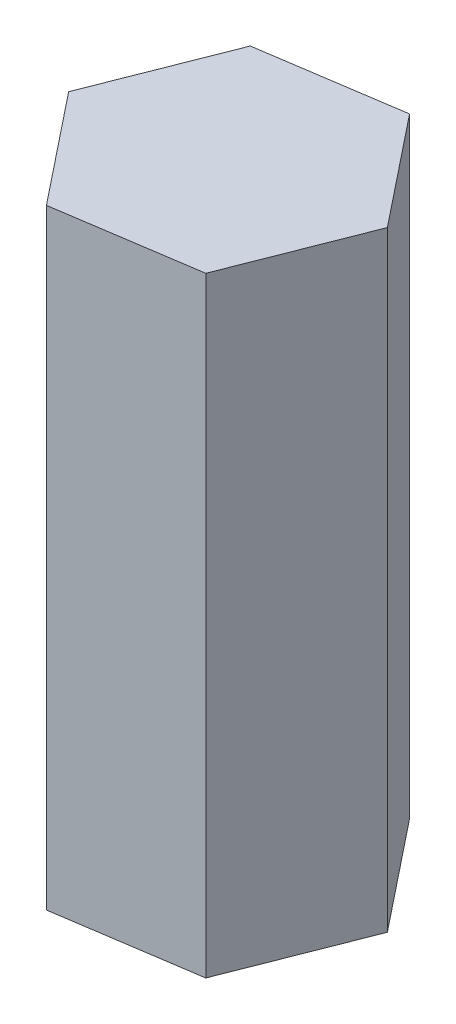
ISO-10303-21;
HEADER;
FILE_DESCRIPTION(('STEP AP214'),'2;1');
FILE_NAME('part.step','',(''),(''),'','','');
FILE_SCHEMA(('AUTOMOTIVE_DESIGN { 1 0 10303 214 1 1 1 1 }'));
ENDSEC;
DATA;
#1=APPLICATION_CONTEXT('core data for automotive mechanical design processes');
#2=APPLICATION_PROTOCOL_DEFINITION('international standard','automotive_design',2000,#1);
#3=PRODUCT_CONTEXT('',#1,'mechanical');
#4=PRODUCT('Part','Part','',(#3));
#5=PRODUCT_RELATED_PRODUCT_CATEGORY('part','',(#4));
#6=PRODUCT_DEFINITION_FORMATION('','',#4);
#7=PRODUCT_DEFINITION_CONTEXT('part definition',#1,'design');
#8=PRODUCT_DEFINITION('design','',#6,#7);
#9=PRODUCT_DEFINITION_SHAPE('','',#8);
#10=(LENGTH_UNIT() NAMED_UNIT(*) SI_UNIT(.MILLI.,.METRE.));
#11=(NAMED_UNIT(*) PLANE_ANGLE_UNIT() SI_UNIT($,.RADIAN.));
#12=(NAMED_UNIT(*) SI_UNIT($,.STERADIAN.) SOLID_ANGLE_UNIT());
#13=UNCERTAINTY_MEASURE_WITH_UNIT(LENGTH_MEASURE(1.E-05),#10,'distance_accuracy_value','');
#14=(GEOMETRIC_REPRESENTATION_CONTEXT(3) GLOBAL_UNCERTAINTY_ASSIGNED_CONTEXT((#13)) GLOBAL_UNIT_ASSIGNED_CONTEXT((#10,
#11,#12)) REPRESENTATION_CONTEXT('',''));
#15=CARTESIAN_POINT('',(0.,0.,0.));
#16=DIRECTION('',(0.,0.,1.));
#17=DIRECTION('',(1.,0.,0.));
#18=AXIS2_PLACEMENT_3D('',#15,#16,#17);
#19=CARTESIAN_POINT('',(3.3550190188715,40.,-8.5448140636886));
#20=DIRECTION('',(0.148899215186265,0.,0.988852377110413));
#21=DIRECTION('',(0.988852377110413,0.,-0.148899215186265));
#22=AXIS2_PLACEMENT_3D('',#19,#20,#21);
#23=PLANE('',#22);
#24=DIRECTION('',(-0.988852377110413,0.,0.148899215186265));
#25=VECTOR('',#24,1.);
#26=CARTESIAN_POINT('',(3.3550190188715,0.,-8.5448140636886));
#27=LINE('',#26,#25);
#28=CARTESIAN_POINT('',(3.3550190188715,0.,-8.5448140636886));
#29=VERTEX_POINT('',#28);
#30=CARTESIAN_POINT('',(-5.72251654033312,0.,-7.17793873236697));
#31=VERTEX_POINT('',#30);
#32=EDGE_CURVE('E132',#29,#31,#27,.T.);
#33=ORIENTED_EDGE('',*,*,#32,.T.);
#34=DIRECTION('',(0.,-1.,0.));
#35=VECTOR('',#34,1.);
#36=CARTESIAN_POINT('',(-5.72251654033312,40.,-7.17793873236697));
#37=LINE('',#36,#35);
#38=CARTESIAN_POINT('',(-5.72251654033312,40.,-7.17793873236697));
#39=VERTEX_POINT('',#38);
#40=EDGE_CURVE('E11',#39,#31,#37,.T.);
#41=ORIENTED_EDGE('',*,*,#40,.F.);
#42=DIRECTION('',(-0.988852377110413,0.,0.148899215186265));
#43=VECTOR('',#42,1.);
#44=CARTESIAN_POINT('',(3.3550190188715,40.,-8.5448140636886));
#45=LINE('',#44,#43);
#46=CARTESIAN_POINT('',(3.3550190188715,40.,-8.5448140636886));
#47=VERTEX_POINT('',#46);
#48=EDGE_CURVE('E148',#47,#39,#45,.T.);
#49=ORIENTED_EDGE('',*,*,#48,.F.);
#50=DIRECTION('',(0.,-1.,0.));
#51=VECTOR('',#50,1.);
#52=CARTESIAN_POINT('',(3.3550190188715,40.,-8.5448140636886));
#53=LINE('',#52,#51);
#54=EDGE_CURVE('E128',#47,#29,#53,.T.);
#55=ORIENTED_EDGE('',*,*,#54,.T.);
#56=EDGE_LOOP('',(#33,#41,#49,#55));
#57=FACE_BOUND('',#56,.T.);
#58=ADVANCED_FACE('F43',(#57),#23,.F.);
#59=CARTESIAN_POINT('',(-5.72251654033312,40.,-7.17793873236697));
#60=DIRECTION('',(0.93082088676338,0.,0.365475685600335));
#61=DIRECTION('',(0.365475685600335,0.,-0.93082088676338));
#62=AXIS2_PLACEMENT_3D('',#59,#60,#61);
#63=PLANE('',#62);
#64=DIRECTION('',(-0.365475685600335,0.,0.93082088676338));
#65=VECTOR('',#64,1.);
#66=CARTESIAN_POINT('',(-5.72251654033312,0.,-7.17793873236697));
#67=LINE('',#66,#65);
#68=CARTESIAN_POINT('',(-9.07753555920462,0.,1.36687533132164));
#69=VERTEX_POINT('',#68);
#70=EDGE_CURVE('E136',#31,#69,#67,.T.);
#71=ORIENTED_EDGE('',*,*,#70,.T.);
#72=DIRECTION('',(0.,-1.,0.));
#73=VECTOR('',#72,1.);
#74=CARTESIAN_POINT('',(-9.07753555920462,40.,1.36687533132164));
#75=LINE('',#74,#73);
#76=CARTESIAN_POINT('',(-9.07753555920462,40.,1.36687533132164));
#77=VERTEX_POINT('',#76);
#78=EDGE_CURVE('E52',#77,#69,#75,.T.);
#79=ORIENTED_EDGE('',*,*,#78,.F.);
#80=DIRECTION('',(-0.365475685600335,0.,0.93082088676338));
#81=VECTOR('',#80,1.);
#82=CARTESIAN_POINT('',(-5.72251654033312,40.,-7.17793873236697));
#83=LINE('',#82,#81);
#84=EDGE_CURVE('E97',#39,#77,#83,.T.);
#85=ORIENTED_EDGE('',*,*,#84,.F.);
#86=ORIENTED_EDGE('',*,*,#40,.T.);
#87=EDGE_LOOP('',(#71,#79,#85,#86));
#88=FACE_BOUND('',#87,.T.);
#89=ADVANCED_FACE('F176',(#88),#63,.F.);
#90=CARTESIAN_POINT('',(-9.07753555920462,40.,1.36687533132164));
#91=DIRECTION('',(0.781921671577115,0.,-0.623376691510078));
#92=DIRECTION('',(-0.623376691510078,0.,-0.781921671577115));
#93=AXIS2_PLACEMENT_3D('',#90,#91,#92);
#94=PLANE('',#93);
#95=DIRECTION('',(0.623376691510078,0.,0.781921671577115));
#96=VECTOR('',#95,1.);
#97=CARTESIAN_POINT('',(-9.07753555920462,0.,1.36687533132164));
#98=LINE('',#97,#96);
#99=CARTESIAN_POINT('',(-3.3550190188715,0.,8.5448140636886));
#100=VERTEX_POINT('',#99);
#101=EDGE_CURVE('E139',#69,#100,#98,.T.);
#102=ORIENTED_EDGE('',*,*,#101,.T.);
#103=DIRECTION('',(0.,-1.,0.));
#104=VECTOR('',#103,1.);
#105=CARTESIAN_POINT('',(-3.3550190188715,40.,8.5448140636886));
#106=LINE('',#105,#104);
#107=CARTESIAN_POINT('',(-3.3550190188715,40.,8.5448140636886));
#108=VERTEX_POINT('',#107);
#109=EDGE_CURVE('E121',#108,#100,#106,.T.);
#110=ORIENTED_EDGE('',*,*,#109,.F.);
#111=DIRECTION('',(0.623376691510078,0.,0.781921671577115));
#112=VECTOR('',#111,1.);
#113=CARTESIAN_POINT('',(-9.07753555920462,40.,1.36687533132164));
#114=LINE('',#113,#112);
#115=EDGE_CURVE('E110',#77,#108,#114,.T.);
#116=ORIENTED_EDGE('',*,*,#115,.F.);
#117=ORIENTED_EDGE('',*,*,#78,.T.);
#118=EDGE_LOOP('',(#102,#110,#116,#117));
#119=FACE_BOUND('',#118,.T.);
#120=ADVANCED_FACE('F158',(#119),#94,.F.);
#121=CARTESIAN_POINT('',(-3.3550190188715,40.,8.5448140636886));
#122=DIRECTION('',(-0.148899215186265,0.,-0.988852377110413));
#123=DIRECTION('',(-0.988852377110413,0.,0.148899215186265));
#124=AXIS2_PLACEMENT_3D('',#121,#122,#123);
#125=PLANE('',#124);
#126=DIRECTION('',(0.988852377110413,0.,-0.148899215186265));
#127=VECTOR('',#126,1.);
#128=CARTESIAN_POINT('',(-3.3550190188715,0.,8.5448140636886));
#129=LINE('',#128,#127);
#130=CARTESIAN_POINT('',(5.72251654033312,0.,7.17793873236697));
#131=VERTEX_POINT('',#130);
#132=EDGE_CURVE('E119',#100,#131,#129,.T.);
#133=ORIENTED_EDGE('',*,*,#132,.T.);
#134=DIRECTION('',(0.,-1.,0.));
#135=VECTOR('',#134,1.);
#136=CARTESIAN_POINT('',(5.72251654033312,40.,7.17793873236697));
#137=LINE('',#136,#135);
#138=CARTESIAN_POINT('',(5.72251654033312,40.,7.17793873236697));
#139=VERTEX_POINT('',#138);
#140=EDGE_CURVE('E116',#139,#131,#137,.T.);
#141=ORIENTED_EDGE('',*,*,#140,.F.);
#142=DIRECTION('',(0.988852377110413,0.,-0.148899215186265));
#143=VECTOR('',#142,1.);
#144=CARTESIAN_POINT('',(-3.3550190188715,40.,8.5448140636886));
#145=LINE('',#144,#143);
#146=EDGE_CURVE('E104',#108,#139,#145,.T.);
#147=ORIENTED_EDGE('',*,*,#146,.F.);
#148=ORIENTED_EDGE('',*,*,#109,.T.);
#149=EDGE_LOOP('',(#133,#141,#147,#148));
#150=FACE_BOUND('',#149,.T.);
#151=ADVANCED_FACE('F117',(#150),#125,.F.);
#152=CARTESIAN_POINT('',(5.72251654033312,40.,7.17793873236697));
#153=DIRECTION('',(-0.93082088676338,0.,-0.365475685600335));
#154=DIRECTION('',(-0.365475685600335,0.,0.93082088676338));
#155=AXIS2_PLACEMENT_3D('',#152,#153,#154);
#156=PLANE('',#155);
#157=DIRECTION('',(0.365475685600335,0.,-0.93082088676338));
#158=VECTOR('',#157,1.);
#159=CARTESIAN_POINT('',(5.72251654033312,0.,7.17793873236697));
#160=LINE('',#159,#158);
#161=CARTESIAN_POINT('',(9.07753555920462,0.,-1.36687533132164));
#162=VERTEX_POINT('',#161);
#163=EDGE_CURVE('E83',#131,#162,#160,.T.);
#164=ORIENTED_EDGE('',*,*,#163,.T.);
#165=DIRECTION('',(0.,-1.,0.));
#166=VECTOR('',#165,1.);
#167=CARTESIAN_POINT('',(9.07753555920462,40.,-1.36687533132164));
#168=LINE('',#167,#166);
#169=CARTESIAN_POINT('',(9.07753555920462,40.,-1.36687533132164));
#170=VERTEX_POINT('',#169);
#171=EDGE_CURVE('E122',#170,#162,#168,.T.);
#172=ORIENTED_EDGE('',*,*,#171,.F.);
#173=DIRECTION('',(0.365475685600335,0.,-0.93082088676338));
#174=VECTOR('',#173,1.);
#175=CARTESIAN_POINT('',(5.72251654033312,40.,7.17793873236697));
#176=LINE('',#175,#174);
#177=EDGE_CURVE('E108',#139,#170,#176,.T.);
#178=ORIENTED_EDGE('',*,*,#177,.F.);
#179=ORIENTED_EDGE('',*,*,#140,.T.);
#180=EDGE_LOOP('',(#164,#172,#178,#179));
#181=FACE_BOUND('',#180,.T.);
#182=ADVANCED_FACE('F124',(#181),#156,.F.);
#183=CARTESIAN_POINT('',(9.07753555920462,40.,-1.36687533132164));
#184=DIRECTION('',(-0.781921671577115,0.,0.623376691510078));
#185=DIRECTION('',(0.623376691510078,0.,0.781921671577115));
#186=AXIS2_PLACEMENT_3D('',#183,#184,#185);
#187=PLANE('',#186);
#188=DIRECTION('',(-0.623376691510078,0.,-0.781921671577115));
#189=VECTOR('',#188,1.);
#190=CARTESIAN_POINT('',(9.07753555920462,0.,-1.36687533132164));
#191=LINE('',#190,#189);
#192=EDGE_CURVE('E89',#162,#29,#191,.T.);
#193=ORIENTED_EDGE('',*,*,#192,.T.);
#194=ORIENTED_EDGE('',*,*,#54,.F.);
#195=DIRECTION('',(-0.623376691510078,0.,-0.781921671577115));
#196=VECTOR('',#195,1.);
#197=CARTESIAN_POINT('',(9.07753555920462,40.,-1.36687533132164));
#198=LINE('',#197,#196);
#199=EDGE_CURVE('E60',#170,#47,#198,.T.);
#200=ORIENTED_EDGE('',*,*,#199,.F.);
#201=ORIENTED_EDGE('',*,*,#171,.T.);
#202=EDGE_LOOP('',(#193,#194,#200,#201));
#203=FACE_BOUND('',#202,.T.);
#204=ADVANCED_FACE('F165',(#203),#187,.F.);
#205=CARTESIAN_POINT('',(0.,40.,0.));
#206=DIRECTION('',(0.,1.,0.));
#207=DIRECTION('',(0.,0.,1.));
#208=AXIS2_PLACEMENT_3D('',#205,#206,#207);
#209=PLANE('',#208);
#210=ORIENTED_EDGE('',*,*,#48,.T.);
#211=ORIENTED_EDGE('',*,*,#84,.T.);
#212=ORIENTED_EDGE('',*,*,#115,.T.);
#213=ORIENTED_EDGE('',*,*,#146,.T.);
#214=ORIENTED_EDGE('',*,*,#177,.T.);
#215=ORIENTED_EDGE('',*,*,#199,.T.);
#216=EDGE_LOOP('',(#210,#211,#212,#213,#214,#215));
#217=FACE_BOUND('',#216,.T.);
#218=ADVANCED_FACE('F106',(#217),#209,.T.);
#219=CARTESIAN_POINT('',(0.,0.,0.));
#220=DIRECTION('',(0.,1.,0.));
#221=DIRECTION('',(0.,0.,1.));
#222=AXIS2_PLACEMENT_3D('',#219,#220,#221);
#223=PLANE('',#222);
#224=ORIENTED_EDGE('',*,*,#32,.F.);
#225=ORIENTED_EDGE('',*,*,#192,.F.);
#226=ORIENTED_EDGE('',*,*,#163,.F.);
#227=ORIENTED_EDGE('',*,*,#132,.F.);
#228=ORIENTED_EDGE('',*,*,#101,.F.);
#229=ORIENTED_EDGE('',*,*,#70,.F.);
#230=EDGE_LOOP('',(#224,#225,#226,#227,#228,#229));
#231=FACE_BOUND('',#230,.T.);
#232=ADVANCED_FACE('F161',(#231),#223,.F.);
#233=CLOSED_SHELL('',(#58,#89,#120,#151,#182,#204,#218,#232));
#234=MANIFOLD_SOLID_BREP('B2',#233);
#235=ADVANCED_BREP_SHAPE_REPRESENTATION('',(#18,#234),#14);
#236=SHAPE_DEFINITION_REPRESENTATION(#9,#235);
ENDSEC;
END-ISO-10303-21;
